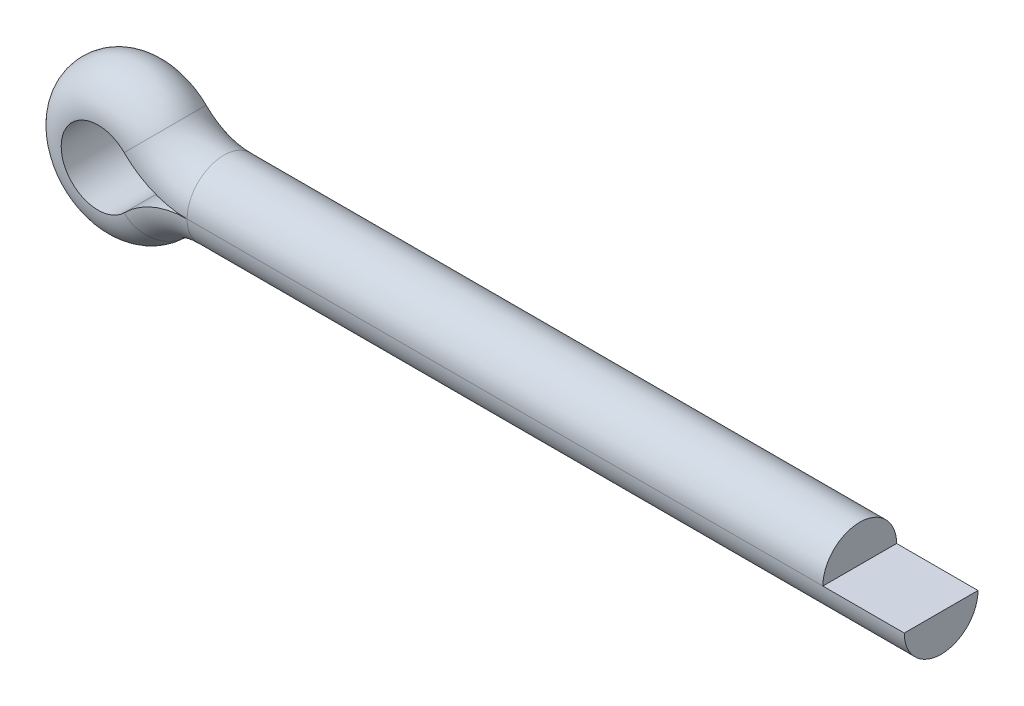
ISO-10303-21;
HEADER;
FILE_DESCRIPTION(('STEP AP214'),'2;1');
FILE_NAME('part.step','',(''),(''),'','','');
FILE_SCHEMA(('AUTOMOTIVE_DESIGN { 1 0 10303 214 1 1 1 1 }'));
ENDSEC;
DATA;
#1=APPLICATION_CONTEXT('core data for automotive mechanical design processes');
#2=APPLICATION_PROTOCOL_DEFINITION('international standard','automotive_design',2000,#1);
#3=PRODUCT_CONTEXT('',#1,'mechanical');
#4=PRODUCT('Part','Part','',(#3));
#5=PRODUCT_RELATED_PRODUCT_CATEGORY('part','',(#4));
#6=PRODUCT_DEFINITION_FORMATION('','',#4);
#7=PRODUCT_DEFINITION_CONTEXT('part definition',#1,'design');
#8=PRODUCT_DEFINITION('design','',#6,#7);
#9=PRODUCT_DEFINITION_SHAPE('','',#8);
#10=(LENGTH_UNIT() NAMED_UNIT(*) SI_UNIT(.MILLI.,.METRE.));
#11=(NAMED_UNIT(*) PLANE_ANGLE_UNIT() SI_UNIT($,.RADIAN.));
#12=(NAMED_UNIT(*) SI_UNIT($,.STERADIAN.) SOLID_ANGLE_UNIT());
#13=UNCERTAINTY_MEASURE_WITH_UNIT(LENGTH_MEASURE(1.E-05),#10,'distance_accuracy_value','');
#14=(GEOMETRIC_REPRESENTATION_CONTEXT(3) GLOBAL_UNCERTAINTY_ASSIGNED_CONTEXT((#13)) GLOBAL_UNIT_ASSIGNED_CONTEXT((#10,
#11,#12)) REPRESENTATION_CONTEXT('',''));
#15=CARTESIAN_POINT('',(0.,0.,0.));
#16=DIRECTION('',(0.,0.,1.));
#17=DIRECTION('',(1.,0.,0.));
#18=AXIS2_PLACEMENT_3D('',#15,#16,#17);
#19=CARTESIAN_POINT('',(6.40000000000002,0.,-1.45));
#20=DIRECTION('',(0.,-1.,0.));
#21=DIRECTION('',(1.,0.,0.));
#22=AXIS2_PLACEMENT_3D('',#19,#20,#21);
#23=PLANE('',#22);
#24=DIRECTION('',(0.,0.,-1.));
#25=VECTOR('',#24,1.);
#26=CARTESIAN_POINT('',(6.40000000000002,0.,-1.45));
#27=LINE('',#26,#25);
#28=CARTESIAN_POINT('',(6.40000000000002,0.,1.45));
#29=VERTEX_POINT('',#28);
#30=CARTESIAN_POINT('',(6.40000000000002,0.,-1.45));
#31=VERTEX_POINT('',#30);
#32=EDGE_CURVE('E147',#29,#31,#27,.T.);
#33=ORIENTED_EDGE('',*,*,#32,.F.);
#34=DIRECTION('',(1.,0.,0.));
#35=VECTOR('',#34,1.);
#36=CARTESIAN_POINT('',(6.40000000000002,0.,1.45));
#37=LINE('',#36,#35);
#38=CARTESIAN_POINT('',(34.6,0.,1.45));
#39=VERTEX_POINT('',#38);
#40=EDGE_CURVE('E46',#29,#39,#37,.T.);
#41=ORIENTED_EDGE('',*,*,#40,.T.);
#42=DIRECTION('',(0.,0.,-1.));
#43=VECTOR('',#42,1.);
#44=CARTESIAN_POINT('',(34.6,0.,-1.45));
#45=LINE('',#44,#43);
#46=CARTESIAN_POINT('',(34.6,0.,-1.45));
#47=VERTEX_POINT('',#46);
#48=EDGE_CURVE('E52',#39,#47,#45,.T.);
#49=ORIENTED_EDGE('',*,*,#48,.T.);
#50=DIRECTION('',(1.,0.,0.));
#51=VECTOR('',#50,1.);
#52=CARTESIAN_POINT('',(6.40000000000002,0.,-1.45));
#53=LINE('',#52,#51);
#54=EDGE_CURVE('E11',#31,#47,#53,.T.);
#55=ORIENTED_EDGE('',*,*,#54,.F.);
#56=EDGE_LOOP('',(#33,#41,#49,#55));
#57=FACE_BOUND('',#56,.T.);
#58=ADVANCED_FACE('F39',(#57),#23,.F.);
#59=CARTESIAN_POINT('',(6.40000000000002,0.,0.));
#60=DIRECTION('',(1.,0.,0.));
#61=DIRECTION('',(0.,1.,0.));
#62=AXIS2_PLACEMENT_3D('',#59,#60,#61);
#63=CYLINDRICAL_SURFACE('',#62,1.45);
#64=CARTESIAN_POINT('',(6.40000000000002,0.,0.));
#65=DIRECTION('',(-1.,0.,0.));
#66=DIRECTION('',(0.,0.,-1.));
#67=AXIS2_PLACEMENT_3D('',#64,#65,#66);
#68=CIRCLE('',#67,1.45);
#69=EDGE_CURVE('E141',#31,#29,#68,.T.);
#70=ORIENTED_EDGE('',*,*,#69,.F.);
#71=ORIENTED_EDGE('',*,*,#54,.T.);
#72=CARTESIAN_POINT('',(34.6,0.,0.));
#73=DIRECTION('',(-1.,0.,0.));
#74=DIRECTION('',(0.,0.,-1.));
#75=AXIS2_PLACEMENT_3D('',#72,#73,#74);
#76=CIRCLE('',#75,1.45);
#77=EDGE_CURVE('E56',#47,#39,#76,.T.);
#78=ORIENTED_EDGE('',*,*,#77,.T.);
#79=ORIENTED_EDGE('',*,*,#40,.F.);
#80=EDGE_LOOP('',(#70,#71,#78,#79));
#81=FACE_BOUND('',#80,.T.);
#82=ADVANCED_FACE('F158',(#81),#63,.T.);
#83=CARTESIAN_POINT('',(6.4,-3.49913793103448,0.));
#84=DIRECTION('',(0.,0.,-1.));
#85=DIRECTION('',(-1.,0.,0.));
#86=AXIS2_PLACEMENT_3D('',#83,#84,#85);
#87=CYLINDRICAL_SURFACE('',#86,3.49913793103448);
#88=DIRECTION('',(0.,0.,-1.));
#89=VECTOR('',#88,1.);
#90=CARTESIAN_POINT('',(3.92543110956281,-1.02517854032397,-1.45));
#91=LINE('',#90,#89);
#92=CARTESIAN_POINT('',(3.92543110956281,-1.02517854032397,1.45));
#93=VERTEX_POINT('',#92);
#94=CARTESIAN_POINT('',(3.92543110956281,-1.02517854032397,-1.45));
#95=VERTEX_POINT('',#94);
#96=EDGE_CURVE('E133',#93,#95,#91,.T.);
#97=ORIENTED_EDGE('',*,*,#96,.F.);
#98=CARTESIAN_POINT('',(6.4,-3.49913793103448,1.45));
#99=DIRECTION('',(0.,0.,-1.));
#100=DIRECTION('',(-1.,0.,0.));
#101=AXIS2_PLACEMENT_3D('',#98,#99,#100);
#102=CIRCLE('',#101,3.49913793103448);
#103=EDGE_CURVE('E146',#93,#29,#102,.T.);
#104=ORIENTED_EDGE('',*,*,#103,.T.);
#105=ORIENTED_EDGE('',*,*,#32,.T.);
#106=CARTESIAN_POINT('',(6.4,-3.49913793103448,-1.45));
#107=DIRECTION('',(0.,0.,-1.));
#108=DIRECTION('',(-1.,0.,0.));
#109=AXIS2_PLACEMENT_3D('',#106,#107,#108);
#110=CIRCLE('',#109,3.49913793103448);
#111=EDGE_CURVE('E152',#95,#31,#110,.T.);
#112=ORIENTED_EDGE('',*,*,#111,.F.);
#113=EDGE_LOOP('',(#97,#104,#105,#112));
#114=FACE_BOUND('',#113,.T.);
#115=ADVANCED_FACE('F162',(#114),#87,.T.);
#116=CARTESIAN_POINT('',(6.4,-3.49913793103448,0.));
#117=DIRECTION('',(0.,0.,-1.));
#118=DIRECTION('',(-1.,0.,0.));
#119=AXIS2_PLACEMENT_3D('',#116,#117,#118);
#120=TOROIDAL_SURFACE('',#119,3.49913793103448,1.45);
#121=CARTESIAN_POINT('',(3.92543110956281,-1.02517854032397,0.));
#122=DIRECTION('',(-0.707019682982048,-0.707193868664006,0.));
#123=DIRECTION('',(0.,0.,-1.));
#124=AXIS2_PLACEMENT_3D('',#121,#122,#123);
#125=CIRCLE('',#124,1.45);
#126=EDGE_CURVE('E131',#95,#93,#125,.T.);
#127=ORIENTED_EDGE('',*,*,#126,.F.);
#128=ORIENTED_EDGE('',*,*,#111,.T.);
#129=ORIENTED_EDGE('',*,*,#69,.T.);
#130=ORIENTED_EDGE('',*,*,#103,.F.);
#131=EDGE_LOOP('',(#127,#128,#129,#130));
#132=FACE_BOUND('',#131,.T.);
#133=ADVANCED_FACE('F165',(#132),#120,.T.);
#134=CARTESIAN_POINT('',(2.9,0.,0.));
#135=DIRECTION('',(0.,0.,1.));
#136=DIRECTION('',(1.,0.,0.));
#137=AXIS2_PLACEMENT_3D('',#134,#135,#136);
#138=CYLINDRICAL_SURFACE('',#137,1.45);
#139=DIRECTION('',(0.,0.,-1.));
#140=VECTOR('',#139,1.);
#141=CARTESIAN_POINT('',(3.92543110956279,1.02517854032398,-1.45));
#142=LINE('',#141,#140);
#143=CARTESIAN_POINT('',(3.92543110956279,1.02517854032398,1.45));
#144=VERTEX_POINT('',#143);
#145=CARTESIAN_POINT('',(3.92543110956279,1.02517854032398,-1.45));
#146=VERTEX_POINT('',#145);
#147=EDGE_CURVE('E101',#144,#146,#142,.T.);
#148=ORIENTED_EDGE('',*,*,#147,.F.);
#149=CARTESIAN_POINT('',(2.9,0.,1.45));
#150=DIRECTION('',(0.,0.,1.));
#151=DIRECTION('',(1.,0.,0.));
#152=AXIS2_PLACEMENT_3D('',#149,#150,#151);
#153=CIRCLE('',#152,1.45);
#154=EDGE_CURVE('E140',#144,#93,#153,.T.);
#155=ORIENTED_EDGE('',*,*,#154,.T.);
#156=ORIENTED_EDGE('',*,*,#96,.T.);
#157=CARTESIAN_POINT('',(2.9,0.,-1.45));
#158=DIRECTION('',(0.,0.,1.));
#159=DIRECTION('',(1.,0.,0.));
#160=AXIS2_PLACEMENT_3D('',#157,#158,#159);
#161=CIRCLE('',#160,1.45);
#162=EDGE_CURVE('E139',#146,#95,#161,.T.);
#163=ORIENTED_EDGE('',*,*,#162,.F.);
#164=EDGE_LOOP('',(#148,#155,#156,#163));
#165=FACE_BOUND('',#164,.T.);
#166=ADVANCED_FACE('F166',(#165),#138,.F.);
#167=CARTESIAN_POINT('',(2.9,0.,0.));
#168=DIRECTION('',(0.,0.,1.));
#169=DIRECTION('',(1.,0.,0.));
#170=AXIS2_PLACEMENT_3D('',#167,#168,#169);
#171=DEGENERATE_TOROIDAL_SURFACE('',#170,1.45,1.45,.T.);
#172=CARTESIAN_POINT('',(3.92543110956279,1.02517854032398,0.));
#173=DIRECTION('',(0.70701968298206,-0.707193868663995,0.));
#174=DIRECTION('',(0.,0.,-1.));
#175=AXIS2_PLACEMENT_3D('',#172,#173,#174);
#176=CIRCLE('',#175,1.45);
#177=EDGE_CURVE('E100',#146,#144,#176,.T.);
#178=ORIENTED_EDGE('',*,*,#177,.F.);
#179=ORIENTED_EDGE('',*,*,#162,.T.);
#180=ORIENTED_EDGE('',*,*,#126,.T.);
#181=ORIENTED_EDGE('',*,*,#154,.F.);
#182=EDGE_LOOP('',(#178,#179,#180,#181));
#183=FACE_BOUND('',#182,.T.);
#184=ADVANCED_FACE('F169',(#183),#171,.T.);
#185=CARTESIAN_POINT('',(6.4,3.49913793103449,0.));
#186=DIRECTION('',(0.,0.,-1.));
#187=DIRECTION('',(-1.,0.,0.));
#188=AXIS2_PLACEMENT_3D('',#185,#186,#187);
#189=CYLINDRICAL_SURFACE('',#188,3.49913793103449);
#190=DIRECTION('',(0.,0.,-1.));
#191=VECTOR('',#190,1.);
#192=CARTESIAN_POINT('',(6.4,0.,-1.45));
#193=LINE('',#192,#191);
#194=CARTESIAN_POINT('',(6.4,0.,1.45));
#195=VERTEX_POINT('',#194);
#196=CARTESIAN_POINT('',(6.4,0.,-1.45));
#197=VERTEX_POINT('',#196);
#198=EDGE_CURVE('E106',#195,#197,#193,.T.);
#199=ORIENTED_EDGE('',*,*,#198,.F.);
#200=CARTESIAN_POINT('',(6.4,3.49913793103449,1.45));
#201=DIRECTION('',(0.,0.,-1.));
#202=DIRECTION('',(-1.,0.,0.));
#203=AXIS2_PLACEMENT_3D('',#200,#201,#202);
#204=CIRCLE('',#203,3.49913793103449);
#205=EDGE_CURVE('E91',#195,#144,#204,.T.);
#206=ORIENTED_EDGE('',*,*,#205,.T.);
#207=ORIENTED_EDGE('',*,*,#147,.T.);
#208=CARTESIAN_POINT('',(6.4,3.49913793103449,-1.45));
#209=DIRECTION('',(0.,0.,-1.));
#210=DIRECTION('',(-1.,0.,0.));
#211=AXIS2_PLACEMENT_3D('',#208,#209,#210);
#212=CIRCLE('',#211,3.49913793103449);
#213=EDGE_CURVE('E105',#197,#146,#212,.T.);
#214=ORIENTED_EDGE('',*,*,#213,.F.);
#215=EDGE_LOOP('',(#199,#206,#207,#214));
#216=FACE_BOUND('',#215,.T.);
#217=ADVANCED_FACE('F108',(#216),#189,.T.);
#218=CARTESIAN_POINT('',(6.4,3.49913793103449,0.));
#219=DIRECTION('',(0.,0.,-1.));
#220=DIRECTION('',(-1.,0.,0.));
#221=AXIS2_PLACEMENT_3D('',#218,#219,#220);
#222=TOROIDAL_SURFACE('',#221,3.49913793103449,1.45);
#223=CARTESIAN_POINT('',(6.4,0.,0.));
#224=DIRECTION('',(1.,0.,0.));
#225=DIRECTION('',(0.,0.,-1.));
#226=AXIS2_PLACEMENT_3D('',#223,#224,#225);
#227=CIRCLE('',#226,1.45);
#228=EDGE_CURVE('E98',#197,#195,#227,.T.);
#229=ORIENTED_EDGE('',*,*,#228,.F.);
#230=ORIENTED_EDGE('',*,*,#213,.T.);
#231=ORIENTED_EDGE('',*,*,#177,.T.);
#232=ORIENTED_EDGE('',*,*,#205,.F.);
#233=EDGE_LOOP('',(#229,#230,#231,#232));
#234=FACE_BOUND('',#233,.T.);
#235=ADVANCED_FACE('F93',(#234),#222,.T.);
#236=CARTESIAN_POINT('',(6.4,0.,0.));
#237=DIRECTION('',(1.,0.,0.));
#238=DIRECTION('',(0.,1.,0.));
#239=AXIS2_PLACEMENT_3D('',#236,#237,#238);
#240=CYLINDRICAL_SURFACE('',#239,1.45);
#241=CARTESIAN_POINT('',(31.4,0.,0.));
#242=DIRECTION('',(1.,0.,0.));
#243=DIRECTION('',(0.,0.,-1.));
#244=AXIS2_PLACEMENT_3D('',#241,#242,#243);
#245=CIRCLE('',#244,1.45);
#246=CARTESIAN_POINT('',(31.4,0.,-1.45));
#247=VERTEX_POINT('',#246);
#248=CARTESIAN_POINT('',(31.4,0.,1.45));
#249=VERTEX_POINT('',#248);
#250=EDGE_CURVE('E124',#247,#249,#245,.T.);
#251=ORIENTED_EDGE('',*,*,#250,.F.);
#252=DIRECTION('',(1.,0.,0.));
#253=VECTOR('',#252,1.);
#254=CARTESIAN_POINT('',(6.4,0.,-1.45));
#255=LINE('',#254,#253);
#256=EDGE_CURVE('E118',#197,#247,#255,.T.);
#257=ORIENTED_EDGE('',*,*,#256,.F.);
#258=ORIENTED_EDGE('',*,*,#228,.T.);
#259=DIRECTION('',(1.,0.,0.));
#260=VECTOR('',#259,1.);
#261=CARTESIAN_POINT('',(6.4,0.,1.45));
#262=LINE('',#261,#260);
#263=EDGE_CURVE('E109',#195,#249,#262,.T.);
#264=ORIENTED_EDGE('',*,*,#263,.T.);
#265=EDGE_LOOP('',(#251,#257,#258,#264));
#266=FACE_BOUND('',#265,.T.);
#267=ADVANCED_FACE('F122',(#266),#240,.T.);
#268=CARTESIAN_POINT('',(6.4,0.,-1.45));
#269=DIRECTION('',(0.,-1.,0.));
#270=DIRECTION('',(1.,0.,0.));
#271=AXIS2_PLACEMENT_3D('',#268,#269,#270);
#272=PLANE('',#271);
#273=DIRECTION('',(0.,0.,-1.));
#274=VECTOR('',#273,1.);
#275=CARTESIAN_POINT('',(31.4,0.,-1.45));
#276=LINE('',#275,#274);
#277=EDGE_CURVE('E114',#249,#247,#276,.T.);
#278=ORIENTED_EDGE('',*,*,#277,.F.);
#279=ORIENTED_EDGE('',*,*,#263,.F.);
#280=ORIENTED_EDGE('',*,*,#198,.T.);
#281=ORIENTED_EDGE('',*,*,#256,.T.);
#282=EDGE_LOOP('',(#278,#279,#280,#281));
#283=FACE_BOUND('',#282,.T.);
#284=ADVANCED_FACE('F113',(#283),#272,.T.);
#285=CARTESIAN_POINT('',(34.6,0.,0.));
#286=DIRECTION('',(-1.,0.,0.));
#287=DIRECTION('',(0.,0.,-1.));
#288=AXIS2_PLACEMENT_3D('',#285,#286,#287);
#289=PLANE('',#288);
#290=ORIENTED_EDGE('',*,*,#77,.F.);
#291=ORIENTED_EDGE('',*,*,#48,.F.);
#292=EDGE_LOOP('',(#290,#291));
#293=FACE_BOUND('',#292,.T.);
#294=ADVANCED_FACE('F231',(#293),#289,.F.);
#295=CARTESIAN_POINT('',(31.4,0.,0.));
#296=DIRECTION('',(1.,0.,0.));
#297=DIRECTION('',(0.,0.,-1.));
#298=AXIS2_PLACEMENT_3D('',#295,#296,#297);
#299=PLANE('',#298);
#300=ORIENTED_EDGE('',*,*,#250,.T.);
#301=ORIENTED_EDGE('',*,*,#277,.T.);
#302=EDGE_LOOP('',(#300,#301));
#303=FACE_BOUND('',#302,.T.);
#304=ADVANCED_FACE('F245',(#303),#299,.T.);
#305=CLOSED_SHELL('',(#58,#82,#115,#133,#166,#184,#217,#235,#267,#284,#294,#304));
#306=MANIFOLD_SOLID_BREP('B2',#305);
#307=ADVANCED_BREP_SHAPE_REPRESENTATION('',(#18,#306),#14);
#308=SHAPE_DEFINITION_REPRESENTATION(#9,#307);
ENDSEC;
END-ISO-10303-21;
